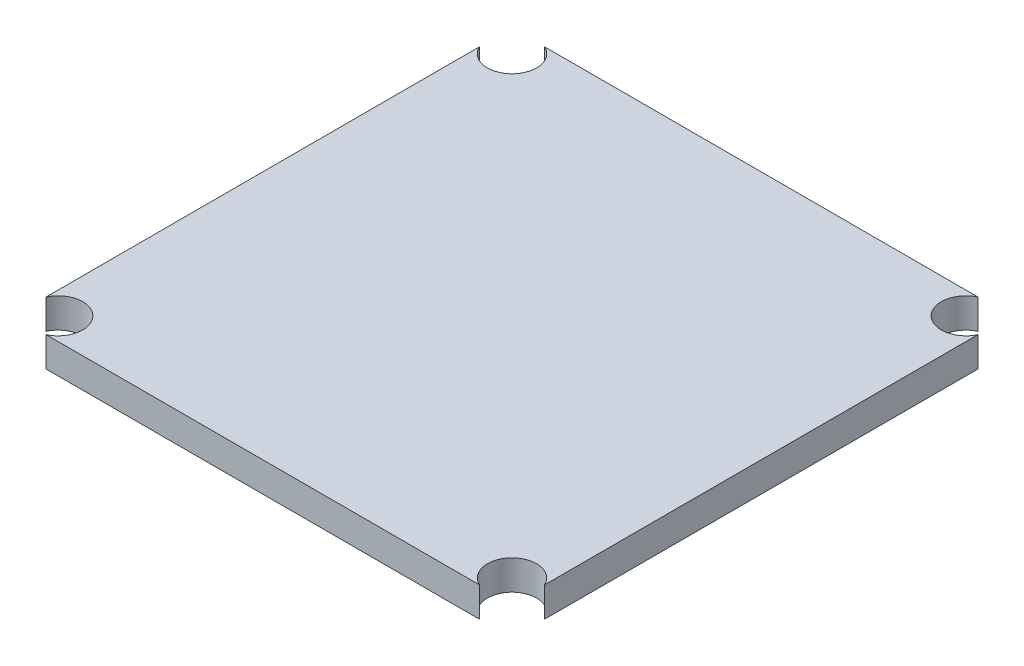
ISO-10303-21;
HEADER;
FILE_DESCRIPTION(('STEP AP214'),'2;1');
FILE_NAME('part.step','',(''),(''),'','','');
FILE_SCHEMA(('AUTOMOTIVE_DESIGN { 1 0 10303 214 1 1 1 1 }'));
ENDSEC;
DATA;
#1=APPLICATION_CONTEXT('core data for automotive mechanical design processes');
#2=APPLICATION_PROTOCOL_DEFINITION('international standard','automotive_design',2000,#1);
#3=PRODUCT_CONTEXT('',#1,'mechanical');
#4=PRODUCT('Part','Part','',(#3));
#5=PRODUCT_RELATED_PRODUCT_CATEGORY('part','',(#4));
#6=PRODUCT_DEFINITION_FORMATION('','',#4);
#7=PRODUCT_DEFINITION_CONTEXT('part definition',#1,'design');
#8=PRODUCT_DEFINITION('design','',#6,#7);
#9=PRODUCT_DEFINITION_SHAPE('','',#8);
#10=(LENGTH_UNIT() NAMED_UNIT(*) SI_UNIT(.MILLI.,.METRE.));
#11=(NAMED_UNIT(*) PLANE_ANGLE_UNIT() SI_UNIT($,.RADIAN.));
#12=(NAMED_UNIT(*) SI_UNIT($,.STERADIAN.) SOLID_ANGLE_UNIT());
#13=UNCERTAINTY_MEASURE_WITH_UNIT(LENGTH_MEASURE(1.E-05),#10,'distance_accuracy_value','');
#14=(GEOMETRIC_REPRESENTATION_CONTEXT(3) GLOBAL_UNCERTAINTY_ASSIGNED_CONTEXT((#13)) GLOBAL_UNIT_ASSIGNED_CONTEXT((#10,
#11,#12)) REPRESENTATION_CONTEXT('',''));
#15=CARTESIAN_POINT('',(0.,0.,0.));
#16=DIRECTION('',(0.,0.,1.));
#17=DIRECTION('',(1.,0.,0.));
#18=AXIS2_PLACEMENT_3D('',#15,#16,#17);
#19=CARTESIAN_POINT('',(16.75,2.,16.75));
#20=DIRECTION('',(-1.,0.,0.));
#21=DIRECTION('',(0.,0.,1.));
#22=AXIS2_PLACEMENT_3D('',#19,#20,#21);
#23=PLANE('',#22);
#24=DIRECTION('',(0.,0.,-1.));
#25=VECTOR('',#24,1.);
#26=CARTESIAN_POINT('',(16.75,0.,16.75));
#27=LINE('',#26,#25);
#28=CARTESIAN_POINT('',(16.75,0.,14.5626136457566));
#29=VERTEX_POINT('',#28);
#30=CARTESIAN_POINT('',(16.75,0.,-14.5626136457566));
#31=VERTEX_POINT('',#30);
#32=EDGE_CURVE('E121',#29,#31,#27,.T.);
#33=ORIENTED_EDGE('',*,*,#32,.T.);
#34=DIRECTION('',(0.,1.,0.));
#35=VECTOR('',#34,1.);
#36=CARTESIAN_POINT('',(16.75,2.,-14.5626136457566));
#37=LINE('',#36,#35);
#38=CARTESIAN_POINT('',(16.75,2.,-14.5626136457566));
#39=VERTEX_POINT('',#38);
#40=EDGE_CURVE('E109',#31,#39,#37,.T.);
#41=ORIENTED_EDGE('',*,*,#40,.T.);
#42=DIRECTION('',(0.,0.,-1.));
#43=VECTOR('',#42,1.);
#44=CARTESIAN_POINT('',(16.75,2.,16.75));
#45=LINE('',#44,#43);
#46=CARTESIAN_POINT('',(16.75,2.,14.5626136457566));
#47=VERTEX_POINT('',#46);
#48=EDGE_CURVE('E119',#47,#39,#45,.T.);
#49=ORIENTED_EDGE('',*,*,#48,.F.);
#50=DIRECTION('',(0.,1.,0.));
#51=VECTOR('',#50,1.);
#52=CARTESIAN_POINT('',(16.75,2.,14.5626136457566));
#53=LINE('',#52,#51);
#54=EDGE_CURVE('E123',#47,#29,#53,.F.);
#55=ORIENTED_EDGE('',*,*,#54,.T.);
#56=EDGE_LOOP('',(#33,#41,#49,#55));
#57=FACE_BOUND('',#56,.T.);
#58=ADVANCED_FACE('F49',(#57),#23,.F.);
#59=CARTESIAN_POINT('',(0.,2.,0.));
#60=DIRECTION('',(0.,-1.,0.));
#61=DIRECTION('',(0.,0.,-1.));
#62=AXIS2_PLACEMENT_3D('',#59,#60,#61);
#63=PLANE('',#62);
#64=ORIENTED_EDGE('',*,*,#48,.T.);
#65=CARTESIAN_POINT('',(15.25,2.,-15.25));
#66=DIRECTION('',(0.,1.,0.));
#67=DIRECTION('',(0.,0.,1.));
#68=AXIS2_PLACEMENT_3D('',#65,#66,#67);
#69=CIRCLE('',#68,1.64999999999999);
#70=CARTESIAN_POINT('',(14.5626136457566,2.,-16.75));
#71=VERTEX_POINT('',#70);
#72=EDGE_CURVE('E53',#71,#39,#69,.T.);
#73=ORIENTED_EDGE('',*,*,#72,.F.);
#74=DIRECTION('',(-1.,0.,0.));
#75=VECTOR('',#74,1.);
#76=CARTESIAN_POINT('',(-16.75,2.,-16.75));
#77=LINE('',#76,#75);
#78=CARTESIAN_POINT('',(-14.5626136457566,2.,-16.75));
#79=VERTEX_POINT('',#78);
#80=EDGE_CURVE('E130',#71,#79,#77,.T.);
#81=ORIENTED_EDGE('',*,*,#80,.T.);
#82=CARTESIAN_POINT('',(-15.25,2.,-15.25));
#83=DIRECTION('',(0.,1.,0.));
#84=DIRECTION('',(0.,0.,1.));
#85=AXIS2_PLACEMENT_3D('',#82,#83,#84);
#86=CIRCLE('',#85,1.64999999999999);
#87=CARTESIAN_POINT('',(-16.75,2.,-14.5626136457567));
#88=VERTEX_POINT('',#87);
#89=EDGE_CURVE('E159',#88,#79,#86,.T.);
#90=ORIENTED_EDGE('',*,*,#89,.F.);
#91=DIRECTION('',(0.,0.,1.));
#92=VECTOR('',#91,1.);
#93=CARTESIAN_POINT('',(-16.75,2.,16.75));
#94=LINE('',#93,#92);
#95=CARTESIAN_POINT('',(-16.75,2.,14.5626136457567));
#96=VERTEX_POINT('',#95);
#97=EDGE_CURVE('E134',#88,#96,#94,.T.);
#98=ORIENTED_EDGE('',*,*,#97,.T.);
#99=CARTESIAN_POINT('',(-15.25,2.,15.25));
#100=DIRECTION('',(0.,1.,0.));
#101=DIRECTION('',(0.,0.,1.));
#102=AXIS2_PLACEMENT_3D('',#99,#100,#101);
#103=CIRCLE('',#102,1.64999999999999);
#104=CARTESIAN_POINT('',(-14.5626136457567,2.,16.75));
#105=VERTEX_POINT('',#104);
#106=EDGE_CURVE('E151',#105,#96,#103,.T.);
#107=ORIENTED_EDGE('',*,*,#106,.F.);
#108=DIRECTION('',(1.,0.,0.));
#109=VECTOR('',#108,1.);
#110=CARTESIAN_POINT('',(-16.75,2.,16.75));
#111=LINE('',#110,#109);
#112=CARTESIAN_POINT('',(14.5626136457567,2.,16.75));
#113=VERTEX_POINT('',#112);
#114=EDGE_CURVE('E146',#105,#113,#111,.T.);
#115=ORIENTED_EDGE('',*,*,#114,.T.);
#116=CARTESIAN_POINT('',(15.25,2.,15.25));
#117=DIRECTION('',(0.,1.,0.));
#118=DIRECTION('',(0.,0.,1.));
#119=AXIS2_PLACEMENT_3D('',#116,#117,#118);
#120=CIRCLE('',#119,1.64999999999999);
#121=EDGE_CURVE('E128',#47,#113,#120,.T.);
#122=ORIENTED_EDGE('',*,*,#121,.F.);
#123=EDGE_LOOP('',(#64,#73,#81,#90,#98,#107,#115,#122));
#124=FACE_BOUND('',#123,.T.);
#125=ADVANCED_FACE('F126',(#124),#63,.F.);
#126=CARTESIAN_POINT('',(0.,0.,0.));
#127=DIRECTION('',(0.,-1.,0.));
#128=DIRECTION('',(0.,0.,-1.));
#129=AXIS2_PLACEMENT_3D('',#126,#127,#128);
#130=PLANE('',#129);
#131=CARTESIAN_POINT('',(15.25,0.,-15.25));
#132=DIRECTION('',(0.,-1.,0.));
#133=DIRECTION('',(0.,0.,-1.));
#134=AXIS2_PLACEMENT_3D('',#131,#132,#133);
#135=CIRCLE('',#134,1.64999999999999);
#136=CARTESIAN_POINT('',(14.5626136457566,0.,-16.75));
#137=VERTEX_POINT('',#136);
#138=EDGE_CURVE('E11',#31,#137,#135,.T.);
#139=ORIENTED_EDGE('',*,*,#138,.F.);
#140=ORIENTED_EDGE('',*,*,#32,.F.);
#141=CARTESIAN_POINT('',(15.25,0.,15.25));
#142=DIRECTION('',(0.,-1.,0.));
#143=DIRECTION('',(0.,0.,-1.));
#144=AXIS2_PLACEMENT_3D('',#141,#142,#143);
#145=CIRCLE('',#144,1.64999999999999);
#146=CARTESIAN_POINT('',(14.5626136457567,0.,16.75));
#147=VERTEX_POINT('',#146);
#148=EDGE_CURVE('E156',#147,#29,#145,.T.);
#149=ORIENTED_EDGE('',*,*,#148,.F.);
#150=DIRECTION('',(1.,0.,0.));
#151=VECTOR('',#150,1.);
#152=CARTESIAN_POINT('',(-16.75,0.,16.75));
#153=LINE('',#152,#151);
#154=CARTESIAN_POINT('',(-14.5626136457567,0.,16.75));
#155=VERTEX_POINT('',#154);
#156=EDGE_CURVE('E160',#155,#147,#153,.T.);
#157=ORIENTED_EDGE('',*,*,#156,.F.);
#158=CARTESIAN_POINT('',(-15.25,0.,15.25));
#159=DIRECTION('',(0.,-1.,0.));
#160=DIRECTION('',(0.,0.,-1.));
#161=AXIS2_PLACEMENT_3D('',#158,#159,#160);
#162=CIRCLE('',#161,1.64999999999999);
#163=CARTESIAN_POINT('',(-16.75,0.,14.5626136457567));
#164=VERTEX_POINT('',#163);
#165=EDGE_CURVE('E155',#164,#155,#162,.T.);
#166=ORIENTED_EDGE('',*,*,#165,.F.);
#167=DIRECTION('',(0.,0.,1.));
#168=VECTOR('',#167,1.);
#169=CARTESIAN_POINT('',(-16.75,0.,16.75));
#170=LINE('',#169,#168);
#171=CARTESIAN_POINT('',(-16.75,0.,-14.5626136457567));
#172=VERTEX_POINT('',#171);
#173=EDGE_CURVE('E181',#172,#164,#170,.T.);
#174=ORIENTED_EDGE('',*,*,#173,.F.);
#175=CARTESIAN_POINT('',(-15.25,0.,-15.25));
#176=DIRECTION('',(0.,-1.,0.));
#177=DIRECTION('',(0.,0.,-1.));
#178=AXIS2_PLACEMENT_3D('',#175,#176,#177);
#179=CIRCLE('',#178,1.64999999999999);
#180=CARTESIAN_POINT('',(-14.5626136457566,0.,-16.75));
#181=VERTEX_POINT('',#180);
#182=EDGE_CURVE('E114',#181,#172,#179,.T.);
#183=ORIENTED_EDGE('',*,*,#182,.F.);
#184=DIRECTION('',(-1.,0.,0.));
#185=VECTOR('',#184,1.);
#186=CARTESIAN_POINT('',(-16.75,0.,-16.75));
#187=LINE('',#186,#185);
#188=EDGE_CURVE('E138',#137,#181,#187,.T.);
#189=ORIENTED_EDGE('',*,*,#188,.F.);
#190=EDGE_LOOP('',(#139,#140,#149,#157,#166,#174,#183,#189));
#191=FACE_BOUND('',#190,.T.);
#192=ADVANCED_FACE('F203',(#191),#130,.T.);
#193=CARTESIAN_POINT('',(-16.75,2.,-16.75));
#194=DIRECTION('',(0.,0.,1.));
#195=DIRECTION('',(1.,0.,0.));
#196=AXIS2_PLACEMENT_3D('',#193,#194,#195);
#197=PLANE('',#196);
#198=ORIENTED_EDGE('',*,*,#80,.F.);
#199=DIRECTION('',(0.,1.,0.));
#200=VECTOR('',#199,1.);
#201=CARTESIAN_POINT('',(14.5626136457566,2.,-16.75));
#202=LINE('',#201,#200);
#203=EDGE_CURVE('E64',#71,#137,#202,.F.);
#204=ORIENTED_EDGE('',*,*,#203,.T.);
#205=ORIENTED_EDGE('',*,*,#188,.T.);
#206=DIRECTION('',(0.,1.,0.));
#207=VECTOR('',#206,1.);
#208=CARTESIAN_POINT('',(-14.5626136457566,2.,-16.75));
#209=LINE('',#208,#207);
#210=EDGE_CURVE('E141',#181,#79,#209,.T.);
#211=ORIENTED_EDGE('',*,*,#210,.T.);
#212=EDGE_LOOP('',(#198,#204,#205,#211));
#213=FACE_BOUND('',#212,.T.);
#214=ADVANCED_FACE('F200',(#213),#197,.F.);
#215=CARTESIAN_POINT('',(-16.75,2.,16.75));
#216=DIRECTION('',(1.,0.,0.));
#217=DIRECTION('',(0.,0.,-1.));
#218=AXIS2_PLACEMENT_3D('',#215,#216,#217);
#219=PLANE('',#218);
#220=ORIENTED_EDGE('',*,*,#97,.F.);
#221=DIRECTION('',(0.,1.,0.));
#222=VECTOR('',#221,1.);
#223=CARTESIAN_POINT('',(-16.75,2.,-14.5626136457567));
#224=LINE('',#223,#222);
#225=EDGE_CURVE('E150',#88,#172,#224,.F.);
#226=ORIENTED_EDGE('',*,*,#225,.T.);
#227=ORIENTED_EDGE('',*,*,#173,.T.);
#228=DIRECTION('',(0.,1.,0.));
#229=VECTOR('',#228,1.);
#230=CARTESIAN_POINT('',(-16.75,2.,14.5626136457567));
#231=LINE('',#230,#229);
#232=EDGE_CURVE('E169',#164,#96,#231,.T.);
#233=ORIENTED_EDGE('',*,*,#232,.T.);
#234=EDGE_LOOP('',(#220,#226,#227,#233));
#235=FACE_BOUND('',#234,.T.);
#236=ADVANCED_FACE('F207',(#235),#219,.F.);
#237=CARTESIAN_POINT('',(-16.75,2.,16.75));
#238=DIRECTION('',(0.,0.,-1.));
#239=DIRECTION('',(-1.,0.,0.));
#240=AXIS2_PLACEMENT_3D('',#237,#238,#239);
#241=PLANE('',#240);
#242=ORIENTED_EDGE('',*,*,#114,.F.);
#243=DIRECTION('',(0.,1.,0.));
#244=VECTOR('',#243,1.);
#245=CARTESIAN_POINT('',(-14.5626136457567,2.,16.75));
#246=LINE('',#245,#244);
#247=EDGE_CURVE('E164',#105,#155,#246,.F.);
#248=ORIENTED_EDGE('',*,*,#247,.T.);
#249=ORIENTED_EDGE('',*,*,#156,.T.);
#250=DIRECTION('',(0.,1.,0.));
#251=VECTOR('',#250,1.);
#252=CARTESIAN_POINT('',(14.5626136457567,2.,16.75));
#253=LINE('',#252,#251);
#254=EDGE_CURVE('E163',#147,#113,#253,.T.);
#255=ORIENTED_EDGE('',*,*,#254,.T.);
#256=EDGE_LOOP('',(#242,#248,#249,#255));
#257=FACE_BOUND('',#256,.T.);
#258=ADVANCED_FACE('F215',(#257),#241,.F.);
#259=CARTESIAN_POINT('',(15.25,2.,15.25));
#260=DIRECTION('',(0.,1.,0.));
#261=DIRECTION('',(0.,0.,1.));
#262=AXIS2_PLACEMENT_3D('',#259,#260,#261);
#263=CYLINDRICAL_SURFACE('',#262,1.64999999999999);
#264=ORIENTED_EDGE('',*,*,#121,.T.);
#265=ORIENTED_EDGE('',*,*,#254,.F.);
#266=ORIENTED_EDGE('',*,*,#148,.T.);
#267=ORIENTED_EDGE('',*,*,#54,.F.);
#268=EDGE_LOOP('',(#264,#265,#266,#267));
#269=FACE_BOUND('',#268,.T.);
#270=ADVANCED_FACE('F219',(#269),#263,.F.);
#271=CARTESIAN_POINT('',(-15.25,2.,15.25));
#272=DIRECTION('',(0.,1.,0.));
#273=DIRECTION('',(0.,0.,1.));
#274=AXIS2_PLACEMENT_3D('',#271,#272,#273);
#275=CYLINDRICAL_SURFACE('',#274,1.64999999999999);
#276=ORIENTED_EDGE('',*,*,#106,.T.);
#277=ORIENTED_EDGE('',*,*,#232,.F.);
#278=ORIENTED_EDGE('',*,*,#165,.T.);
#279=ORIENTED_EDGE('',*,*,#247,.F.);
#280=EDGE_LOOP('',(#276,#277,#278,#279));
#281=FACE_BOUND('',#280,.T.);
#282=ADVANCED_FACE('F212',(#281),#275,.F.);
#283=CARTESIAN_POINT('',(-15.25,2.,-15.25));
#284=DIRECTION('',(0.,1.,0.));
#285=DIRECTION('',(0.,0.,1.));
#286=AXIS2_PLACEMENT_3D('',#283,#284,#285);
#287=CYLINDRICAL_SURFACE('',#286,1.64999999999999);
#288=ORIENTED_EDGE('',*,*,#89,.T.);
#289=ORIENTED_EDGE('',*,*,#210,.F.);
#290=ORIENTED_EDGE('',*,*,#182,.T.);
#291=ORIENTED_EDGE('',*,*,#225,.F.);
#292=EDGE_LOOP('',(#288,#289,#290,#291));
#293=FACE_BOUND('',#292,.T.);
#294=ADVANCED_FACE('F196',(#293),#287,.F.);
#295=CARTESIAN_POINT('',(15.25,2.,-15.25));
#296=DIRECTION('',(0.,1.,0.));
#297=DIRECTION('',(0.,0.,1.));
#298=AXIS2_PLACEMENT_3D('',#295,#296,#297);
#299=CYLINDRICAL_SURFACE('',#298,1.64999999999999);
#300=ORIENTED_EDGE('',*,*,#72,.T.);
#301=ORIENTED_EDGE('',*,*,#40,.F.);
#302=ORIENTED_EDGE('',*,*,#138,.T.);
#303=ORIENTED_EDGE('',*,*,#203,.F.);
#304=EDGE_LOOP('',(#300,#301,#302,#303));
#305=FACE_BOUND('',#304,.T.);
#306=ADVANCED_FACE('F51',(#305),#299,.F.);
#307=CLOSED_SHELL('',(#58,#125,#192,#214,#236,#258,#270,#282,#294,#306));
#308=MANIFOLD_SOLID_BREP('B2',#307);
#309=ADVANCED_BREP_SHAPE_REPRESENTATION('',(#18,#308),#14);
#310=SHAPE_DEFINITION_REPRESENTATION(#9,#309);
ENDSEC;
END-ISO-10303-21;
